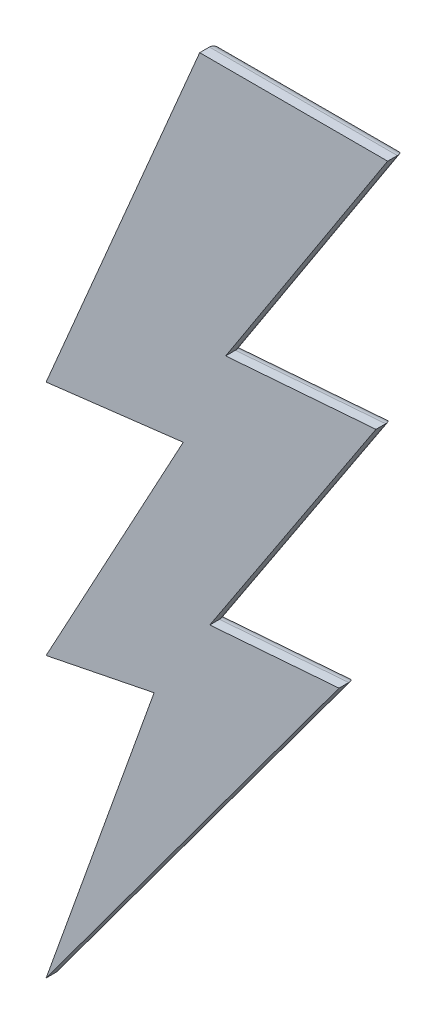
ISO-10303-21;
HEADER;
FILE_DESCRIPTION(('STEP AP214'),'2;1');
FILE_NAME('part.step','',(''),(''),'','','');
FILE_SCHEMA(('AUTOMOTIVE_DESIGN { 1 0 10303 214 1 1 1 1 }'));
ENDSEC;
DATA;
#1=APPLICATION_CONTEXT('core data for automotive mechanical design processes');
#2=APPLICATION_PROTOCOL_DEFINITION('international standard','automotive_design',2000,#1);
#3=PRODUCT_CONTEXT('',#1,'mechanical');
#4=PRODUCT('Part','Part','',(#3));
#5=PRODUCT_RELATED_PRODUCT_CATEGORY('part','',(#4));
#6=PRODUCT_DEFINITION_FORMATION('','',#4);
#7=PRODUCT_DEFINITION_CONTEXT('part definition',#1,'design');
#8=PRODUCT_DEFINITION('design','',#6,#7);
#9=PRODUCT_DEFINITION_SHAPE('','',#8);
#10=(LENGTH_UNIT() NAMED_UNIT(*) SI_UNIT(.MILLI.,.METRE.));
#11=(NAMED_UNIT(*) PLANE_ANGLE_UNIT() SI_UNIT($,.RADIAN.));
#12=(NAMED_UNIT(*) SI_UNIT($,.STERADIAN.) SOLID_ANGLE_UNIT());
#13=UNCERTAINTY_MEASURE_WITH_UNIT(LENGTH_MEASURE(1.E-05),#10,'distance_accuracy_value','');
#14=(GEOMETRIC_REPRESENTATION_CONTEXT(3) GLOBAL_UNCERTAINTY_ASSIGNED_CONTEXT((#13)) GLOBAL_UNIT_ASSIGNED_CONTEXT((#10,
#11,#12)) REPRESENTATION_CONTEXT('',''));
#15=CARTESIAN_POINT('',(0.,0.,0.));
#16=DIRECTION('',(0.,0.,1.));
#17=DIRECTION('',(1.,0.,0.));
#18=AXIS2_PLACEMENT_3D('',#15,#16,#17);
#19=CARTESIAN_POINT('',(0.,0.,2.));
#20=DIRECTION('',(-0.805039310996333,0.593221466023061,0.));
#21=DIRECTION('',(-0.593221466023061,-0.805039310996333,0.));
#22=AXIS2_PLACEMENT_3D('',#19,#20,#21);
#23=PLANE('',#22);
#24=DIRECTION('',(0.,0.,-1.));
#25=VECTOR('',#24,1.);
#26=CARTESIAN_POINT('',(0.,0.,2.));
#27=LINE('',#26,#25);
#28=CARTESIAN_POINT('',(0.,0.,2.));
#29=VERTEX_POINT('',#28);
#30=CARTESIAN_POINT('',(0.,0.,1.));
#31=VERTEX_POINT('',#30);
#32=EDGE_CURVE('E633',#29,#31,#27,.T.);
#33=ORIENTED_EDGE('',*,*,#32,.T.);
#34=DIRECTION('',(0.593221466023061,0.805039310996333,0.));
#35=VECTOR('',#34,1.);
#36=CARTESIAN_POINT('',(0.,0.,1.));
#37=LINE('',#36,#35);
#38=CARTESIAN_POINT('',(30.0193637336725,40.7381884858572,1.));
#39=VERTEX_POINT('',#38);
#40=EDGE_CURVE('E12',#31,#39,#37,.T.);
#41=ORIENTED_EDGE('',*,*,#40,.T.);
#42=DIRECTION('',(0.,0.,-1.));
#43=VECTOR('',#42,1.);
#44=CARTESIAN_POINT('',(30.0193637336725,40.7381884858572,2.));
#45=LINE('',#44,#43);
#46=CARTESIAN_POINT('',(30.0193637336725,40.7381884858572,2.));
#47=VERTEX_POINT('',#46);
#48=EDGE_CURVE('E164',#47,#39,#45,.T.);
#49=ORIENTED_EDGE('',*,*,#48,.F.);
#50=DIRECTION('',(0.593221466023061,0.805039310996333,0.));
#51=VECTOR('',#50,1.);
#52=CARTESIAN_POINT('',(0.,0.,2.));
#53=LINE('',#52,#51);
#54=EDGE_CURVE('E171',#29,#47,#53,.T.);
#55=ORIENTED_EDGE('',*,*,#54,.F.);
#56=EDGE_LOOP('',(#33,#41,#49,#55));
#57=FACE_BOUND('',#56,.T.);
#58=ADVANCED_FACE('F40',(#57),#23,.F.);
#59=CARTESIAN_POINT('',(30.0193637336725,40.7381884858572,2.));
#60=DIRECTION('',(0.0766964988847388,-0.997054485501581,0.));
#61=DIRECTION('',(0.997054485501581,0.0766964988847388,0.));
#62=AXIS2_PLACEMENT_3D('',#59,#60,#61);
#63=PLANE('',#62);
#64=ORIENTED_EDGE('',*,*,#48,.T.);
#65=DIRECTION('',(-0.997054485501581,-0.0766964988847388,0.));
#66=VECTOR('',#65,1.);
#67=CARTESIAN_POINT('',(30.0193637336725,40.7381884858572,1.));
#68=LINE('',#67,#66);
#69=CARTESIAN_POINT('',(16.7720708350185,39.7191659551915,1.));
#70=VERTEX_POINT('',#69);
#71=EDGE_CURVE('E180',#39,#70,#68,.T.);
#72=ORIENTED_EDGE('',*,*,#71,.T.);
#73=DIRECTION('',(0.,0.,-1.));
#74=VECTOR('',#73,1.);
#75=CARTESIAN_POINT('',(16.7720708350185,39.7191659551915,2.));
#76=LINE('',#75,#74);
#77=CARTESIAN_POINT('',(16.7720708350185,39.7191659551915,2.));
#78=VERTEX_POINT('',#77);
#79=EDGE_CURVE('E167',#78,#70,#76,.T.);
#80=ORIENTED_EDGE('',*,*,#79,.F.);
#81=DIRECTION('',(-0.997054485501581,-0.0766964988847388,0.));
#82=VECTOR('',#81,1.);
#83=CARTESIAN_POINT('',(30.0193637336725,40.7381884858572,2.));
#84=LINE('',#83,#82);
#85=EDGE_CURVE('E159',#47,#78,#84,.T.);
#86=ORIENTED_EDGE('',*,*,#85,.F.);
#87=EDGE_LOOP('',(#64,#72,#80,#86));
#88=FACE_BOUND('',#87,.T.);
#89=ADVANCED_FACE('F161',(#88),#63,.F.);
#90=CARTESIAN_POINT('',(16.7720708350185,39.7191659551915,2.));
#91=DIRECTION('',(-0.835343007802263,0.549729078106542,0.));
#92=DIRECTION('',(-0.549729078106542,-0.835343007802263,0.));
#93=AXIS2_PLACEMENT_3D('',#90,#91,#92);
#94=PLANE('',#93);
#95=ORIENTED_EDGE('',*,*,#79,.T.);
#96=DIRECTION('',(0.549729078106542,0.835343007802263,0.));
#97=VECTOR('',#96,1.);
#98=CARTESIAN_POINT('',(16.7720708350185,39.7191659551915,1.));
#99=LINE('',#98,#97);
#100=CARTESIAN_POINT('',(33.8031239011241,65.5987704019538,1.));
#101=VERTEX_POINT('',#100);
#102=EDGE_CURVE('E210',#70,#101,#99,.T.);
#103=ORIENTED_EDGE('',*,*,#102,.T.);
#104=DIRECTION('',(0.,0.,-1.));
#105=VECTOR('',#104,1.);
#106=CARTESIAN_POINT('',(33.8031239011241,65.5987704019538,2.));
#107=LINE('',#106,#105);
#108=CARTESIAN_POINT('',(33.8031239011241,65.5987704019538,2.));
#109=VERTEX_POINT('',#108);
#110=EDGE_CURVE('E184',#109,#101,#107,.T.);
#111=ORIENTED_EDGE('',*,*,#110,.F.);
#112=DIRECTION('',(0.549729078106542,0.835343007802263,0.));
#113=VECTOR('',#112,1.);
#114=CARTESIAN_POINT('',(16.7720708350185,39.7191659551915,2.));
#115=LINE('',#114,#113);
#116=EDGE_CURVE('E170',#78,#109,#115,.T.);
#117=ORIENTED_EDGE('',*,*,#116,.F.);
#118=EDGE_LOOP('',(#95,#103,#111,#117));
#119=FACE_BOUND('',#118,.T.);
#120=ADVANCED_FACE('F347',(#119),#94,.F.);
#121=CARTESIAN_POINT('',(33.8031239011241,65.5987704019538,2.));
#122=DIRECTION('',(0.0766964988847387,-0.997054485501581,0.));
#123=DIRECTION('',(0.997054485501581,0.0766964988847387,0.));
#124=AXIS2_PLACEMENT_3D('',#121,#122,#123);
#125=PLANE('',#124);
#126=ORIENTED_EDGE('',*,*,#110,.T.);
#127=DIRECTION('',(-0.997054485501581,-0.0766964988847387,0.));
#128=VECTOR('',#127,1.);
#129=CARTESIAN_POINT('',(33.8031239011241,65.5987704019538,1.));
#130=LINE('',#129,#128);
#131=CARTESIAN_POINT('',(18.3994167136387,64.4138698490703,1.));
#132=VERTEX_POINT('',#131);
#133=EDGE_CURVE('E212',#101,#132,#130,.T.);
#134=ORIENTED_EDGE('',*,*,#133,.T.);
#135=DIRECTION('',(0.,0.,-1.));
#136=VECTOR('',#135,1.);
#137=CARTESIAN_POINT('',(18.3994167136387,64.4138698490703,2.));
#138=LINE('',#137,#136);
#139=CARTESIAN_POINT('',(18.3994167136387,64.4138698490703,2.));
#140=VERTEX_POINT('',#139);
#141=EDGE_CURVE('E293',#140,#132,#138,.T.);
#142=ORIENTED_EDGE('',*,*,#141,.F.);
#143=DIRECTION('',(-0.997054485501581,-0.0766964988847387,0.));
#144=VECTOR('',#143,1.);
#145=CARTESIAN_POINT('',(33.8031239011241,65.5987704019538,2.));
#146=LINE('',#145,#144);
#147=EDGE_CURVE('E302',#109,#140,#146,.T.);
#148=ORIENTED_EDGE('',*,*,#147,.F.);
#149=EDGE_LOOP('',(#126,#134,#142,#148));
#150=FACE_BOUND('',#149,.T.);
#151=ADVANCED_FACE('F300',(#150),#125,.F.);
#152=CARTESIAN_POINT('',(18.3994167136387,64.4138698490703,2.));
#153=DIRECTION('',(-0.838898792013402,0.544287439464163,0.));
#154=DIRECTION('',(-0.544287439464163,-0.838898792013402,0.));
#155=AXIS2_PLACEMENT_3D('',#152,#153,#154);
#156=PLANE('',#155);
#157=ORIENTED_EDGE('',*,*,#141,.T.);
#158=DIRECTION('',(0.544287439464163,0.838898792013402,0.));
#159=VECTOR('',#158,1.);
#160=CARTESIAN_POINT('',(18.3994167136387,64.4138698490703,1.));
#161=LINE('',#160,#159);
#162=CARTESIAN_POINT('',(35.,90.,1.));
#163=VERTEX_POINT('',#162);
#164=EDGE_CURVE('E214',#132,#163,#161,.T.);
#165=ORIENTED_EDGE('',*,*,#164,.T.);
#166=DIRECTION('',(0.,0.,-1.));
#167=VECTOR('',#166,1.);
#168=CARTESIAN_POINT('',(35.,90.,2.));
#169=LINE('',#168,#167);
#170=CARTESIAN_POINT('',(35.,90.,2.));
#171=VERTEX_POINT('',#170);
#172=EDGE_CURVE('E290',#171,#163,#169,.T.);
#173=ORIENTED_EDGE('',*,*,#172,.F.);
#174=DIRECTION('',(0.544287439464163,0.838898792013402,0.));
#175=VECTOR('',#174,1.);
#176=CARTESIAN_POINT('',(18.3994167136387,64.4138698490703,2.));
#177=LINE('',#176,#175);
#178=EDGE_CURVE('E646',#140,#171,#177,.T.);
#179=ORIENTED_EDGE('',*,*,#178,.F.);
#180=EDGE_LOOP('',(#157,#165,#173,#179));
#181=FACE_BOUND('',#180,.T.);
#182=ADVANCED_FACE('F429',(#181),#156,.F.);
#183=CARTESIAN_POINT('',(35.,90.,2.));
#184=DIRECTION('',(0.,-1.,0.));
#185=DIRECTION('',(0.,0.,-1.));
#186=AXIS2_PLACEMENT_3D('',#183,#184,#185);
#187=PLANE('',#186);
#188=ORIENTED_EDGE('',*,*,#172,.T.);
#189=DIRECTION('',(-1.,0.,0.));
#190=VECTOR('',#189,1.);
#191=CARTESIAN_POINT('',(35.,90.,1.));
#192=LINE('',#191,#190);
#193=CARTESIAN_POINT('',(15.7384966782223,90.,1.));
#194=VERTEX_POINT('',#193);
#195=EDGE_CURVE('E216',#163,#194,#192,.T.);
#196=ORIENTED_EDGE('',*,*,#195,.T.);
#197=DIRECTION('',(0.,0.,-1.));
#198=VECTOR('',#197,1.);
#199=CARTESIAN_POINT('',(15.7384966782223,90.,2.));
#200=LINE('',#199,#198);
#201=CARTESIAN_POINT('',(15.7384966782223,90.,2.));
#202=VERTEX_POINT('',#201);
#203=EDGE_CURVE('E282',#202,#194,#200,.T.);
#204=ORIENTED_EDGE('',*,*,#203,.F.);
#205=DIRECTION('',(-1.,0.,0.));
#206=VECTOR('',#205,1.);
#207=CARTESIAN_POINT('',(35.,90.,2.));
#208=LINE('',#207,#206);
#209=EDGE_CURVE('E644',#171,#202,#208,.T.);
#210=ORIENTED_EDGE('',*,*,#209,.F.);
#211=EDGE_LOOP('',(#188,#196,#204,#210));
#212=FACE_BOUND('',#211,.T.);
#213=ADVANCED_FACE('F440',(#212),#187,.F.);
#214=CARTESIAN_POINT('',(15.7384966782223,90.,2.));
#215=DIRECTION('',(0.92061679717066,-0.390467300509576,0.));
#216=DIRECTION('',(0.390467300509576,0.92061679717066,0.));
#217=AXIS2_PLACEMENT_3D('',#214,#215,#216);
#218=PLANE('',#217);
#219=ORIENTED_EDGE('',*,*,#203,.T.);
#220=DIRECTION('',(-0.390467300509576,-0.92061679717066,0.));
#221=VECTOR('',#220,1.);
#222=CARTESIAN_POINT('',(15.7384966782223,90.,1.));
#223=LINE('',#222,#221);
#224=CARTESIAN_POINT('',(0.,52.892860976381,1.));
#225=VERTEX_POINT('',#224);
#226=EDGE_CURVE('E218',#194,#225,#223,.T.);
#227=ORIENTED_EDGE('',*,*,#226,.T.);
#228=DIRECTION('',(0.,0.,-1.));
#229=VECTOR('',#228,1.);
#230=CARTESIAN_POINT('',(0.,52.892860976381,2.));
#231=LINE('',#230,#229);
#232=CARTESIAN_POINT('',(0.,52.892860976381,2.));
#233=VERTEX_POINT('',#232);
#234=EDGE_CURVE('E275',#233,#225,#231,.T.);
#235=ORIENTED_EDGE('',*,*,#234,.F.);
#236=DIRECTION('',(-0.390467300509576,-0.92061679717066,0.));
#237=VECTOR('',#236,1.);
#238=CARTESIAN_POINT('',(15.7384966782223,90.,2.));
#239=LINE('',#238,#237);
#240=EDGE_CURVE('E642',#202,#233,#239,.T.);
#241=ORIENTED_EDGE('',*,*,#240,.F.);
#242=EDGE_LOOP('',(#219,#227,#235,#241));
#243=FACE_BOUND('',#242,.T.);
#244=ADVANCED_FACE('F452',(#243),#218,.F.);
#245=CARTESIAN_POINT('',(0.,52.892860976381,2.));
#246=DIRECTION('',(-0.118961060189592,0.992898920413638,0.));
#247=DIRECTION('',(-0.992898920413638,-0.118961060189592,0.));
#248=AXIS2_PLACEMENT_3D('',#245,#246,#247);
#249=PLANE('',#248);
#250=ORIENTED_EDGE('',*,*,#234,.T.);
#251=DIRECTION('',(0.992898920413638,0.118961060189592,0.));
#252=VECTOR('',#251,1.);
#253=CARTESIAN_POINT('',(0.,52.892860976381,1.));
#254=LINE('',#253,#252);
#255=CARTESIAN_POINT('',(14.05459017624,54.5767674783633,1.));
#256=VERTEX_POINT('',#255);
#257=EDGE_CURVE('E220',#225,#256,#254,.T.);
#258=ORIENTED_EDGE('',*,*,#257,.T.);
#259=DIRECTION('',(0.,0.,-1.));
#260=VECTOR('',#259,1.);
#261=CARTESIAN_POINT('',(14.05459017624,54.5767674783633,2.));
#262=LINE('',#261,#260);
#263=CARTESIAN_POINT('',(14.05459017624,54.5767674783633,2.));
#264=VERTEX_POINT('',#263);
#265=EDGE_CURVE('E272',#264,#256,#262,.T.);
#266=ORIENTED_EDGE('',*,*,#265,.F.);
#267=DIRECTION('',(0.992898920413638,0.118961060189592,0.));
#268=VECTOR('',#267,1.);
#269=CARTESIAN_POINT('',(0.,52.892860976381,2.));
#270=LINE('',#269,#268);
#271=EDGE_CURVE('E640',#233,#264,#270,.T.);
#272=ORIENTED_EDGE('',*,*,#271,.F.);
#273=EDGE_LOOP('',(#250,#258,#266,#272));
#274=FACE_BOUND('',#273,.T.);
#275=ADVANCED_FACE('F270',(#274),#249,.F.);
#276=CARTESIAN_POINT('',(14.05459017624,54.5767674783633,2.));
#277=DIRECTION('',(0.879324634469992,-0.476222833570814,0.));
#278=DIRECTION('',(0.476222833570814,0.879324634469992,0.));
#279=AXIS2_PLACEMENT_3D('',#276,#277,#278);
#280=PLANE('',#279);
#281=ORIENTED_EDGE('',*,*,#265,.T.);
#282=DIRECTION('',(-0.476222833570814,-0.879324634469992,0.));
#283=VECTOR('',#282,1.);
#284=CARTESIAN_POINT('',(14.05459017624,54.5767674783633,1.));
#285=LINE('',#284,#283);
#286=CARTESIAN_POINT('',(0.,28.6255813987692,1.));
#287=VERTEX_POINT('',#286);
#288=EDGE_CURVE('E222',#256,#287,#285,.T.);
#289=ORIENTED_EDGE('',*,*,#288,.T.);
#290=DIRECTION('',(0.,0.,-1.));
#291=VECTOR('',#290,1.);
#292=CARTESIAN_POINT('',(0.,28.6255813987692,2.));
#293=LINE('',#292,#291);
#294=CARTESIAN_POINT('',(0.,28.6255813987692,2.));
#295=VERTEX_POINT('',#294);
#296=EDGE_CURVE('E280',#295,#287,#293,.T.);
#297=ORIENTED_EDGE('',*,*,#296,.F.);
#298=DIRECTION('',(-0.476222833570814,-0.879324634469992,0.));
#299=VECTOR('',#298,1.);
#300=CARTESIAN_POINT('',(14.05459017624,54.5767674783633,2.));
#301=LINE('',#300,#299);
#302=EDGE_CURVE('E279',#264,#295,#301,.T.);
#303=ORIENTED_EDGE('',*,*,#302,.F.);
#304=EDGE_LOOP('',(#281,#289,#297,#303));
#305=FACE_BOUND('',#304,.T.);
#306=ADVANCED_FACE('F277',(#305),#280,.F.);
#307=CARTESIAN_POINT('',(0.,28.6255813987692,2.));
#308=DIRECTION('',(-0.197008015118985,0.980401877792407,0.));
#309=DIRECTION('',(-0.980401877792407,-0.197008015118985,0.));
#310=AXIS2_PLACEMENT_3D('',#307,#308,#309);
#311=PLANE('',#310);
#312=ORIENTED_EDGE('',*,*,#296,.T.);
#313=DIRECTION('',(0.980401877792407,0.197008015118985,0.));
#314=VECTOR('',#313,1.);
#315=CARTESIAN_POINT('',(0.,28.6255813987692,1.));
#316=LINE('',#315,#314);
#317=CARTESIAN_POINT('',(11.0647169789881,30.84899404134,1.));
#318=VERTEX_POINT('',#317);
#319=EDGE_CURVE('E64',#287,#318,#316,.T.);
#320=ORIENTED_EDGE('',*,*,#319,.T.);
#321=DIRECTION('',(0.,0.,-1.));
#322=VECTOR('',#321,1.);
#323=CARTESIAN_POINT('',(11.0647169789881,30.84899404134,2.));
#324=LINE('',#323,#322);
#325=CARTESIAN_POINT('',(11.0647169789881,30.84899404134,2.));
#326=VERTEX_POINT('',#325);
#327=EDGE_CURVE('E284',#326,#318,#324,.T.);
#328=ORIENTED_EDGE('',*,*,#327,.F.);
#329=DIRECTION('',(0.980401877792407,0.197008015118985,0.));
#330=VECTOR('',#329,1.);
#331=CARTESIAN_POINT('',(0.,28.6255813987692,2.));
#332=LINE('',#331,#330);
#333=EDGE_CURVE('E637',#295,#326,#332,.T.);
#334=ORIENTED_EDGE('',*,*,#333,.F.);
#335=EDGE_LOOP('',(#312,#320,#328,#334));
#336=FACE_BOUND('',#335,.T.);
#337=ADVANCED_FACE('F485',(#336),#311,.F.);
#338=CARTESIAN_POINT('',(11.0647169789881,30.84899404134,2.));
#339=DIRECTION('',(0.941284688962625,-0.337613883489014,0.));
#340=DIRECTION('',(0.337613883489014,0.941284688962625,0.));
#341=AXIS2_PLACEMENT_3D('',#338,#339,#340);
#342=PLANE('',#341);
#343=ORIENTED_EDGE('',*,*,#327,.T.);
#344=DIRECTION('',(-0.337613883489014,-0.941284688962625,0.));
#345=VECTOR('',#344,1.);
#346=CARTESIAN_POINT('',(11.0647169789881,30.84899404134,1.));
#347=LINE('',#346,#345);
#348=EDGE_CURVE('E49',#318,#31,#347,.T.);
#349=ORIENTED_EDGE('',*,*,#348,.T.);
#350=ORIENTED_EDGE('',*,*,#32,.F.);
#351=DIRECTION('',(-0.337613883489014,-0.941284688962625,0.));
#352=VECTOR('',#351,1.);
#353=CARTESIAN_POINT('',(11.0647169789881,30.84899404134,2.));
#354=LINE('',#353,#352);
#355=EDGE_CURVE('E176',#326,#29,#354,.T.);
#356=ORIENTED_EDGE('',*,*,#355,.F.);
#357=EDGE_LOOP('',(#343,#349,#350,#356));
#358=FACE_BOUND('',#357,.T.);
#359=ADVANCED_FACE('F496',(#358),#342,.F.);
#360=CARTESIAN_POINT('',(0.,0.,2.));
#361=DIRECTION('',(0.,0.,1.));
#362=DIRECTION('',(1.,0.,0.));
#363=AXIS2_PLACEMENT_3D('',#360,#361,#362);
#364=PLANE('',#363);
#365=ORIENTED_EDGE('',*,*,#54,.T.);
#366=ORIENTED_EDGE('',*,*,#85,.T.);
#367=ORIENTED_EDGE('',*,*,#116,.T.);
#368=ORIENTED_EDGE('',*,*,#147,.T.);
#369=ORIENTED_EDGE('',*,*,#178,.T.);
#370=ORIENTED_EDGE('',*,*,#209,.T.);
#371=ORIENTED_EDGE('',*,*,#240,.T.);
#372=ORIENTED_EDGE('',*,*,#271,.T.);
#373=ORIENTED_EDGE('',*,*,#302,.T.);
#374=ORIENTED_EDGE('',*,*,#333,.T.);
#375=ORIENTED_EDGE('',*,*,#355,.T.);
#376=EDGE_LOOP('',(#365,#366,#367,#368,#369,#370,#371,#372,#373,#374,#375));
#377=FACE_BOUND('',#376,.T.);
#378=ADVANCED_FACE('F174',(#377),#364,.T.);
#379=CARTESIAN_POINT('',(0.,0.,0.));
#380=DIRECTION('',(0.,0.,1.));
#381=DIRECTION('',(1.,0.,0.));
#382=AXIS2_PLACEMENT_3D('',#379,#380,#381);
#383=PLANE('',#382);
#384=DIRECTION('',(0.549729078106542,0.835343007802263,0.));
#385=VECTOR('',#384,1.);
#386=CARTESIAN_POINT('',(-7.37135772208088,4.85100090274806,0.));
#387=LINE('',#386,#385);
#388=CARTESIAN_POINT('',(31.8469533505102,64.4453415280293,0.));
#389=VERTEX_POINT('',#388);
#390=CARTESIAN_POINT('',(14.8159002844047,38.565737081267,0.));
#391=VERTEX_POINT('',#390);
#392=EDGE_CURVE('E205',#389,#391,#387,.F.);
#393=ORIENTED_EDGE('',*,*,#392,.T.);
#394=DIRECTION('',(-0.997054485501581,-0.0766964988847388,0.));
#395=VECTOR('',#394,1.);
#396=CARTESIAN_POINT('',(-2.8619922457181,37.2058991943344,0.));
#397=LINE('',#396,#395);
#398=CARTESIAN_POINT('',(27.9190746918391,39.5736735741466,0.));
#399=VERTEX_POINT('',#398);
#400=EDGE_CURVE('E207',#391,#399,#397,.F.);
#401=ORIENTED_EDGE('',*,*,#400,.T.);
#402=DIRECTION('',(0.593221466023061,0.805039310996333,0.));
#403=VECTOR('',#402,1.);
#404=CARTESIAN_POINT('',(-0.805039310996333,0.593221466023061,0.));
#405=LINE('',#404,#403);
#406=CARTESIAN_POINT('',(3.24787990656609,6.09329097008819,0.));
#407=VERTEX_POINT('',#406);
#408=EDGE_CURVE('E182',#399,#407,#405,.F.);
#409=ORIENTED_EDGE('',*,*,#408,.T.);
#410=DIRECTION('',(-0.337613883489014,-0.941284688962625,0.));
#411=VECTOR('',#410,1.);
#412=CARTESIAN_POINT('',(0.941284688962626,-0.337613883489015,0.));
#413=LINE('',#412,#411);
#414=CARTESIAN_POINT('',(12.6038712980278,32.1782711131978,0.));
#415=VERTEX_POINT('',#414);
#416=EDGE_CURVE('E189',#407,#415,#413,.F.);
#417=ORIENTED_EDGE('',*,*,#416,.T.);
#418=DIRECTION('',(0.980401877792407,0.197008015118985,0.));
#419=VECTOR('',#418,1.);
#420=CARTESIAN_POINT('',(-5.7259539859987,28.4949626878661,0.));
#421=LINE('',#420,#419);
#422=CARTESIAN_POINT('',(1.89597574309235,30.0265603737923,0.));
#423=VERTEX_POINT('',#422);
#424=EDGE_CURVE('E191',#415,#423,#421,.F.);
#425=ORIENTED_EDGE('',*,*,#424,.T.);
#426=DIRECTION('',(-0.476222833570814,-0.879324634469992,0.));
#427=VECTOR('',#426,1.);
#428=CARTESIAN_POINT('',(-11.1077655055886,6.015720879809,0.));
#429=LINE('',#428,#427);
#430=CARTESIAN_POINT('',(15.8540395355235,55.7995147072877,0.));
#431=VERTEX_POINT('',#430);
#432=EDGE_CURVE('E193',#423,#431,#429,.F.);
#433=ORIENTED_EDGE('',*,*,#432,.T.);
#434=DIRECTION('',(0.992898920413638,0.118961060189592,0.));
#435=VECTOR('',#434,1.);
#436=CARTESIAN_POINT('',(-6.36647053062786,53.137234206145,0.));
#437=LINE('',#436,#435);
#438=CARTESIAN_POINT('',(1.59442133568016,54.0910434177375,0.));
#439=VERTEX_POINT('',#438);
#440=EDGE_CURVE('E195',#431,#439,#437,.F.);
#441=ORIENTED_EDGE('',*,*,#440,.T.);
#442=DIRECTION('',(-0.390467300509576,-0.92061679717066,0.));
#443=VECTOR('',#442,1.);
#444=CARTESIAN_POINT('',(-18.0928199035903,7.67382755569169,0.));
#445=LINE('',#444,#443);
#446=CARTESIAN_POINT('',(16.4005883339076,89.,0.));
#447=VERTEX_POINT('',#446);
#448=EDGE_CURVE('E197',#439,#447,#445,.F.);
#449=ORIENTED_EDGE('',*,*,#448,.T.);
#450=DIRECTION('',(-1.,0.,0.));
#451=VECTOR('',#450,1.);
#452=CARTESIAN_POINT('',(0.,89.,0.));
#453=LINE('',#452,#451);
#454=CARTESIAN_POINT('',(33.1591492869386,89.,0.));
#455=VERTEX_POINT('',#454);
#456=EDGE_CURVE('E199',#447,#455,#453,.F.);
#457=ORIENTED_EDGE('',*,*,#456,.T.);
#458=DIRECTION('',(0.544287439464163,0.838898792013402,0.));
#459=VECTOR('',#458,1.);
#460=CARTESIAN_POINT('',(-17.3017941712692,11.2256083061157,0.));
#461=LINE('',#460,#459);
#462=CARTESIAN_POINT('',(16.4598481161925,63.2617180484663,0.));
#463=VERTEX_POINT('',#462);
#464=EDGE_CURVE('E201',#455,#463,#461,.F.);
#465=ORIENTED_EDGE('',*,*,#464,.T.);
#466=DIRECTION('',(-0.997054485501581,-0.0766964988847387,0.));
#467=VECTOR('',#466,1.);
#468=CARTESIAN_POINT('',(-4.74083815596404,61.6308960275312,0.));
#469=LINE('',#468,#467);
#470=EDGE_CURVE('E203',#463,#389,#469,.F.);
#471=ORIENTED_EDGE('',*,*,#470,.T.);
#472=EDGE_LOOP('',(#393,#401,#409,#417,#425,#433,#441,#449,#457,#465,#471));
#473=FACE_BOUND('',#472,.T.);
#474=ADVANCED_FACE('F316',(#473),#383,.F.);
#475=CARTESIAN_POINT('',(-0.118961060189591,53.8857598967946,1.));
#476=DIRECTION('',(0.992898920413638,0.118961060189592,0.));
#477=DIRECTION('',(-0.118961060189592,0.992898920413638,0.));
#478=AXIS2_PLACEMENT_3D('',#475,#476,#477);
#479=CYLINDRICAL_SURFACE('',#478,1.);
#480=CARTESIAN_POINT('',(15.8540395355235,55.7995147072877,1.));
#481=DIRECTION('',(0.56203391954516,-0.82711418394361,0.));
#482=DIRECTION('',(0.82711418394361,0.56203391954516,0.));
#483=AXIS2_PLACEMENT_3D('',#480,#481,#482);
#484=ELLIPSE('',#483,2.17557550603705,1.);
#485=EDGE_CURVE('E250',#256,#431,#484,.T.);
#486=ORIENTED_EDGE('',*,*,#485,.F.);
#487=ORIENTED_EDGE('',*,*,#257,.F.);
#488=CARTESIAN_POINT('',(1.59442133568015,54.0910434177375,1.));
#489=DIRECTION('',(0.600759098594013,-0.799430112928272,0.));
#490=DIRECTION('',(0.799430112928272,0.600759098594013,0.));
#491=AXIS2_PLACEMENT_3D('',#488,#489,#490);
#492=ELLIPSE('',#491,1.99444743185852,1.);
#493=EDGE_CURVE('E44',#439,#225,#492,.F.);
#494=ORIENTED_EDGE('',*,*,#493,.F.);
#495=ORIENTED_EDGE('',*,*,#440,.F.);
#496=EDGE_LOOP('',(#486,#487,#494,#495));
#497=FACE_BOUND('',#496,.T.);
#498=ADVANCED_FACE('F42',(#497),#479,.T.);
#499=CARTESIAN_POINT('',(16.6591134753929,89.6095326994904,1.));
#500=DIRECTION('',(-0.390467300509576,-0.92061679717066,0.));
#501=DIRECTION('',(0.92061679717066,-0.390467300509576,0.));
#502=AXIS2_PLACEMENT_3D('',#499,#500,#501);
#503=CYLINDRICAL_SURFACE('',#502,1.);
#504=ORIENTED_EDGE('',*,*,#493,.T.);
#505=ORIENTED_EDGE('',*,*,#226,.F.);
#506=CARTESIAN_POINT('',(16.4005883339076,89.,1.));
#507=DIRECTION('',(-0.833806722361236,-0.552056473329687,0.));
#508=DIRECTION('',(0.552056473329687,-0.833806722361237,0.));
#509=AXIS2_PLACEMENT_3D('',#506,#507,#508);
#510=ELLIPSE('',#509,1.19931870681988,1.);
#511=EDGE_CURVE('E248',#447,#194,#510,.F.);
#512=ORIENTED_EDGE('',*,*,#511,.F.);
#513=ORIENTED_EDGE('',*,*,#448,.F.);
#514=EDGE_LOOP('',(#504,#505,#512,#513));
#515=FACE_BOUND('',#514,.T.);
#516=ADVANCED_FACE('F261',(#515),#503,.T.);
#517=CARTESIAN_POINT('',(14.93391481071,54.1005446447925,1.));
#518=DIRECTION('',(-0.476222833570814,-0.879324634469992,0.));
#519=DIRECTION('',(0.879324634469992,-0.476222833570814,0.));
#520=AXIS2_PLACEMENT_3D('',#517,#518,#519);
#521=CYLINDRICAL_SURFACE('',#520,1.);
#522=ORIENTED_EDGE('',*,*,#485,.T.);
#523=ORIENTED_EDGE('',*,*,#432,.F.);
#524=CARTESIAN_POINT('',(1.89597574309234,30.0265603737923,1.));
#525=DIRECTION('',(0.59428286219683,-0.804256103302389,0.));
#526=DIRECTION('',(0.804256103302389,0.59428286219683,0.));
#527=AXIS2_PLACEMENT_3D('',#524,#525,#526);
#528=ELLIPSE('',#527,2.35742785824964,1.);
#529=EDGE_CURVE('E245',#287,#423,#528,.T.);
#530=ORIENTED_EDGE('',*,*,#529,.F.);
#531=ORIENTED_EDGE('',*,*,#288,.F.);
#532=EDGE_LOOP('',(#522,#523,#530,#531));
#533=FACE_BOUND('',#532,.T.);
#534=ADVANCED_FACE('F332',(#533),#521,.T.);
#535=CARTESIAN_POINT('',(35.,89.,1.));
#536=DIRECTION('',(-1.,0.,0.));
#537=DIRECTION('',(0.,0.,1.));
#538=AXIS2_PLACEMENT_3D('',#535,#536,#537);
#539=CYLINDRICAL_SURFACE('',#538,1.);
#540=ORIENTED_EDGE('',*,*,#511,.T.);
#541=ORIENTED_EDGE('',*,*,#195,.F.);
#542=CARTESIAN_POINT('',(33.1591492869386,89.,1.));
#543=DIRECTION('',(-0.477342937800402,0.878717087424662,0.));
#544=DIRECTION('',(-0.878717087424662,-0.477342937800402,0.));
#545=AXIS2_PLACEMENT_3D('',#542,#543,#544);
#546=ELLIPSE('',#545,2.09492991476527,1.);
#547=EDGE_CURVE('E242',#455,#163,#546,.F.);
#548=ORIENTED_EDGE('',*,*,#547,.F.);
#549=ORIENTED_EDGE('',*,*,#456,.F.);
#550=EDGE_LOOP('',(#540,#541,#548,#549));
#551=FACE_BOUND('',#550,.T.);
#552=ADVANCED_FACE('F334',(#551),#539,.T.);
#553=CARTESIAN_POINT('',(-0.197008015118985,29.6059832765616,1.));
#554=DIRECTION('',(0.980401877792407,0.197008015118985,0.));
#555=DIRECTION('',(-0.197008015118985,0.980401877792407,0.));
#556=AXIS2_PLACEMENT_3D('',#553,#554,#555);
#557=CYLINDRICAL_SURFACE('',#556,1.);
#558=ORIENTED_EDGE('',*,*,#529,.T.);
#559=ORIENTED_EDGE('',*,*,#424,.F.);
#560=CARTESIAN_POINT('',(12.6038712980278,32.1782711131978,1.));
#561=DIRECTION('',(0.653621963711824,-0.756821199857337,0.));
#562=DIRECTION('',(0.756821199857337,0.653621963711824,0.));
#563=AXIS2_PLACEMENT_3D('',#560,#561,#562);
#564=ELLIPSE('',#563,2.03370930852613,1.);
#565=EDGE_CURVE('E239',#318,#415,#564,.T.);
#566=ORIENTED_EDGE('',*,*,#565,.F.);
#567=ORIENTED_EDGE('',*,*,#319,.F.);
#568=EDGE_LOOP('',(#558,#559,#566,#567));
#569=FACE_BOUND('',#568,.T.);
#570=ADVANCED_FACE('F330',(#569),#557,.T.);
#571=CARTESIAN_POINT('',(17.5605179216253,64.9581572885345,1.));
#572=DIRECTION('',(0.544287439464163,0.838898792013402,0.));
#573=DIRECTION('',(-0.838898792013402,0.544287439464163,0.));
#574=AXIS2_PLACEMENT_3D('',#571,#572,#573);
#575=CYLINDRICAL_SURFACE('',#574,1.);
#576=ORIENTED_EDGE('',*,*,#547,.T.);
#577=ORIENTED_EDGE('',*,*,#164,.F.);
#578=CARTESIAN_POINT('',(16.4598481161925,63.2617180484663,1.));
#579=DIRECTION('',(-0.510713406592264,0.859751019962713,0.));
#580=DIRECTION('',(-0.859751019962713,-0.510713406592264,0.));
#581=AXIS2_PLACEMENT_3D('',#578,#579,#580);
#582=ELLIPSE('',#581,2.25596545093989,1.);
#583=EDGE_CURVE('E236',#463,#132,#582,.F.);
#584=ORIENTED_EDGE('',*,*,#583,.F.);
#585=ORIENTED_EDGE('',*,*,#464,.F.);
#586=EDGE_LOOP('',(#576,#577,#584,#585));
#587=FACE_BOUND('',#586,.T.);
#588=ADVANCED_FACE('F361',(#587),#575,.T.);
#589=CARTESIAN_POINT('',(12.0060016679507,30.511380157851,1.));
#590=DIRECTION('',(-0.337613883489014,-0.941284688962625,0.));
#591=DIRECTION('',(0.941284688962625,-0.337613883489014,0.));
#592=AXIS2_PLACEMENT_3D('',#589,#590,#591);
#593=CYLINDRICAL_SURFACE('',#592,1.);
#594=ORIENTED_EDGE('',*,*,#565,.T.);
#595=ORIENTED_EDGE('',*,*,#416,.F.);
#596=CARTESIAN_POINT('',(3.24787990656609,6.09329097008819,1.));
#597=DIRECTION('',(0.882465686171643,-0.470376777413184,0.));
#598=DIRECTION('',(0.470376777413183,0.882465686171643,0.));
#599=AXIS2_PLACEMENT_3D('',#596,#597,#598);
#600=ELLIPSE('',#599,6.90484748083793,1.);
#601=EDGE_CURVE('E233',#31,#407,#600,.T.);
#602=ORIENTED_EDGE('',*,*,#601,.F.);
#603=ORIENTED_EDGE('',*,*,#348,.F.);
#604=EDGE_LOOP('',(#594,#595,#602,#603));
#605=FACE_BOUND('',#604,.T.);
#606=ADVANCED_FACE('F327',(#605),#593,.T.);
#607=CARTESIAN_POINT('',(33.8798204000089,64.6017159164522,1.));
#608=DIRECTION('',(-0.997054485501581,-0.0766964988847387,0.));
#609=DIRECTION('',(0.0766964988847387,-0.997054485501581,0.));
#610=AXIS2_PLACEMENT_3D('',#607,#608,#609);
#611=CYLINDRICAL_SURFACE('',#610,1.);
#612=ORIENTED_EDGE('',*,*,#583,.T.);
#613=ORIENTED_EDGE('',*,*,#133,.F.);
#614=CARTESIAN_POINT('',(31.8469533505102,64.4453415280293,1.));
#615=DIRECTION('',(-0.507916351838324,0.86140639627022,0.));
#616=DIRECTION('',(-0.86140639627022,-0.507916351838324,0.));
#617=AXIS2_PLACEMENT_3D('',#614,#615,#616);
#618=ELLIPSE('',#617,2.27090321024299,1.);
#619=EDGE_CURVE('E230',#389,#101,#618,.F.);
#620=ORIENTED_EDGE('',*,*,#619,.F.);
#621=ORIENTED_EDGE('',*,*,#470,.F.);
#622=EDGE_LOOP('',(#612,#613,#620,#621));
#623=FACE_BOUND('',#622,.T.);
#624=ADVANCED_FACE('F306',(#623),#611,.T.);
#625=CARTESIAN_POINT('',(-0.805039310996333,0.593221466023061,1.));
#626=DIRECTION('',(0.593221466023061,0.805039310996333,0.));
#627=DIRECTION('',(-0.805039310996333,0.593221466023061,0.));
#628=AXIS2_PLACEMENT_3D('',#625,#626,#627);
#629=CYLINDRICAL_SURFACE('',#628,1.);
#630=ORIENTED_EDGE('',*,*,#601,.T.);
#631=ORIENTED_EDGE('',*,*,#408,.F.);
#632=CARTESIAN_POINT('',(27.9190746918391,39.5736735741466,1.));
#633=DIRECTION('',(-0.484906987485169,0.87456572851219,0.));
#634=DIRECTION('',(0.87456572851219,0.484906987485169,0.));
#635=AXIS2_PLACEMENT_3D('',#632,#633,#634);
#636=ELLIPSE('',#635,2.40152223367639,1.);
#637=EDGE_CURVE('E228',#39,#399,#636,.T.);
#638=ORIENTED_EDGE('',*,*,#637,.F.);
#639=ORIENTED_EDGE('',*,*,#40,.F.);
#640=EDGE_LOOP('',(#630,#631,#638,#639));
#641=FACE_BOUND('',#640,.T.);
#642=ADVANCED_FACE('F322',(#641),#629,.T.);
#643=CARTESIAN_POINT('',(15.9367278272163,40.2688950332981,1.));
#644=DIRECTION('',(0.549729078106542,0.835343007802263,0.));
#645=DIRECTION('',(-0.835343007802263,0.549729078106542,0.));
#646=AXIS2_PLACEMENT_3D('',#643,#644,#645);
#647=CYLINDRICAL_SURFACE('',#646,1.);
#648=ORIENTED_EDGE('',*,*,#619,.T.);
#649=ORIENTED_EDGE('',*,*,#102,.F.);
#650=CARTESIAN_POINT('',(14.8159002844047,38.565737081267,1.));
#651=DIRECTION('',(-0.507916351838324,0.86140639627022,0.));
#652=DIRECTION('',(-0.86140639627022,-0.507916351838324,0.));
#653=AXIS2_PLACEMENT_3D('',#650,#651,#652);
#654=ELLIPSE('',#653,2.27090321024299,1.);
#655=EDGE_CURVE('E226',#391,#70,#654,.F.);
#656=ORIENTED_EDGE('',*,*,#655,.F.);
#657=ORIENTED_EDGE('',*,*,#392,.F.);
#658=EDGE_LOOP('',(#648,#649,#656,#657));
#659=FACE_BOUND('',#658,.T.);
#660=ADVANCED_FACE('F312',(#659),#647,.T.);
#661=CARTESIAN_POINT('',(30.0960602325573,39.7411340003557,1.));
#662=DIRECTION('',(-0.997054485501581,-0.0766964988847388,0.));
#663=DIRECTION('',(0.0766964988847388,-0.997054485501581,0.));
#664=AXIS2_PLACEMENT_3D('',#661,#662,#663);
#665=CYLINDRICAL_SURFACE('',#664,1.);
#666=ORIENTED_EDGE('',*,*,#637,.T.);
#667=ORIENTED_EDGE('',*,*,#400,.F.);
#668=ORIENTED_EDGE('',*,*,#655,.T.);
#669=ORIENTED_EDGE('',*,*,#71,.F.);
#670=EDGE_LOOP('',(#666,#667,#668,#669));
#671=FACE_BOUND('',#670,.T.);
#672=ADVANCED_FACE('F318',(#671),#665,.T.);
#673=CLOSED_SHELL('',(#58,#89,#120,#151,#182,#213,#244,#275,#306,#337,#359,#378,#474,#498,#516,
#534,#552,#570,#588,#606,#624,#642,#660,#672));
#674=MANIFOLD_SOLID_BREP('B2',#673);
#675=ADVANCED_BREP_SHAPE_REPRESENTATION('',(#18,#674),#14);
#676=SHAPE_DEFINITION_REPRESENTATION(#9,#675);
ENDSEC;
END-ISO-10303-21;
